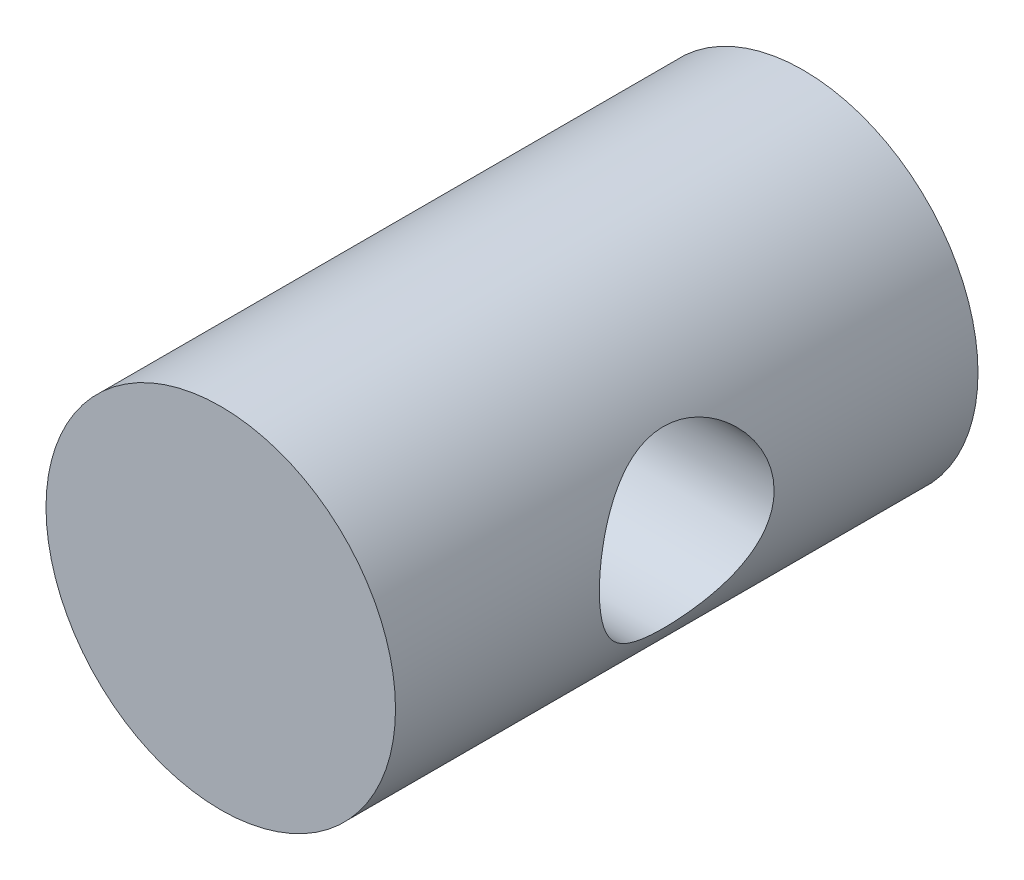
ISO-10303-21;
HEADER;
FILE_DESCRIPTION(('STEP AP214'),'2;1');
FILE_NAME('part.step','',(''),(''),'','','');
FILE_SCHEMA(('AUTOMOTIVE_DESIGN { 1 0 10303 214 1 1 1 1 }'));
ENDSEC;
DATA;
#1=APPLICATION_CONTEXT('core data for automotive mechanical design processes');
#2=APPLICATION_PROTOCOL_DEFINITION('international standard','automotive_design',2000,#1);
#3=PRODUCT_CONTEXT('',#1,'mechanical');
#4=PRODUCT('Part','Part','',(#3));
#5=PRODUCT_RELATED_PRODUCT_CATEGORY('part','',(#4));
#6=PRODUCT_DEFINITION_FORMATION('','',#4);
#7=PRODUCT_DEFINITION_CONTEXT('part definition',#1,'design');
#8=PRODUCT_DEFINITION('design','',#6,#7);
#9=PRODUCT_DEFINITION_SHAPE('','',#8);
#10=(LENGTH_UNIT() NAMED_UNIT(*) SI_UNIT(.MILLI.,.METRE.));
#11=(NAMED_UNIT(*) PLANE_ANGLE_UNIT() SI_UNIT($,.RADIAN.));
#12=(NAMED_UNIT(*) SI_UNIT($,.STERADIAN.) SOLID_ANGLE_UNIT());
#13=UNCERTAINTY_MEASURE_WITH_UNIT(LENGTH_MEASURE(1.E-05),#10,'distance_accuracy_value','');
#14=(GEOMETRIC_REPRESENTATION_CONTEXT(3) GLOBAL_UNCERTAINTY_ASSIGNED_CONTEXT((#13)) GLOBAL_UNIT_ASSIGNED_CONTEXT((#10,
#11,#12)) REPRESENTATION_CONTEXT('',''));
#15=CARTESIAN_POINT('',(0.,0.,0.));
#16=DIRECTION('',(0.,0.,1.));
#17=DIRECTION('',(1.,0.,0.));
#18=AXIS2_PLACEMENT_3D('',#15,#16,#17);
#19=CARTESIAN_POINT('',(0.,0.,10.));
#20=DIRECTION('',(0.,0.,-1.));
#21=DIRECTION('',(-1.,0.,0.));
#22=AXIS2_PLACEMENT_3D('',#19,#20,#21);
#23=CYLINDRICAL_SURFACE('',#22,3.);
#24=CARTESIAN_POINT('',(3.,0.,6.5));
#25=CARTESIAN_POINT('',(2.99999570107562,-0.0788579444268502,6.49999504652421));
#26=CARTESIAN_POINT('',(2.99685736529635,-0.157809899546344,6.49374489031842));
#27=CARTESIAN_POINT('',(2.98461234055736,-0.313380352903344,6.46902067948769));
#28=CARTESIAN_POINT('',(2.97549431743379,-0.389994130070444,6.45052341050328));
#29=CARTESIAN_POINT('',(2.95224419105063,-0.538400317320674,6.40220928707506));
#30=CARTESIAN_POINT('',(2.93813158766306,-0.61021020440872,6.37243642362805));
#31=CARTESIAN_POINT('',(2.90618664773642,-0.747708925209898,6.30264406795252));
#32=CARTESIAN_POINT('',(2.88835460450288,-0.813398240985089,6.2626253836267));
#33=CARTESIAN_POINT('',(2.84934387387093,-0.941261726642864,6.17072412577207));
#34=CARTESIAN_POINT('',(2.82802798691306,-1.00298281668316,6.11827028114054));
#35=CARTESIAN_POINT('',(2.78489955370115,-1.11716916730047,6.00421778112945));
#36=CARTESIAN_POINT('',(2.76308664313552,-1.16962737466015,5.94261222234134));
#37=CARTESIAN_POINT('',(2.71948426796021,-1.26787800067542,5.80627497571493));
#38=CARTESIAN_POINT('',(2.69782780455198,-1.31283800332746,5.73089585248113));
#39=CARTESIAN_POINT('',(2.65928968158481,-1.38925234033604,5.57244899602068));
#40=CARTESIAN_POINT('',(2.64240461410484,-1.4207163224495,5.48938680691588));
#41=CARTESIAN_POINT('',(2.61686800556713,-1.46719866328288,5.32300234186712));
#42=CARTESIAN_POINT('',(2.6077840737557,-1.48308878562066,5.23999332189891));
#43=CARTESIAN_POINT('',(2.59772834922792,-1.50064048996327,5.07203174333078));
#44=CARTESIAN_POINT('',(2.59674854014932,-1.50231613255961,4.98708118869327));
#45=CARTESIAN_POINT('',(2.60266395385873,-1.49203093075844,4.82857096352695));
#46=CARTESIAN_POINT('',(2.6086314549302,-1.48167683930523,4.75486395316543));
#47=CARTESIAN_POINT('',(2.62614343100775,-1.4504097735854,4.61041713594044));
#48=CARTESIAN_POINT('',(2.63768968247664,-1.42949343584648,4.53967828204203));
#49=CARTESIAN_POINT('',(2.66531214619112,-1.37731467057901,4.40115630115151));
#50=CARTESIAN_POINT('',(2.68148760995998,-1.34582260067399,4.33348040182132));
#51=CARTESIAN_POINT('',(2.71655106422106,-1.273562531502,4.20404856111499));
#52=CARTESIAN_POINT('',(2.73544027170286,-1.2327903657187,4.14229529659987));
#53=CARTESIAN_POINT('',(2.77669736854929,-1.13709908236918,4.01821812088516));
#54=CARTESIAN_POINT('',(2.79920265355119,-1.08104168755392,3.95681468963576));
#55=CARTESIAN_POINT('',(2.84321434950611,-0.95933336811206,3.84389687211365));
#56=CARTESIAN_POINT('',(2.86472027938201,-0.893677884861428,3.79238721194918));
#57=CARTESIAN_POINT('',(2.90552980924446,-0.750774758747773,3.69847150845541));
#58=CARTESIAN_POINT('',(2.92468476243011,-0.673130387399113,3.65659929133139));
#59=CARTESIAN_POINT('',(2.95736821681863,-0.510699323233195,3.58685445643549));
#60=CARTESIAN_POINT('',(2.9709011841533,-0.425918364397914,3.55897072247725));
#61=CARTESIAN_POINT('',(2.98986500612153,-0.259149737491053,3.52028689442499));
#62=CARTESIAN_POINT('',(2.99587407451965,-0.177512295822489,3.50826314637983));
#63=CARTESIAN_POINT('',(3.00109520188655,-0.0131693999240275,3.49780290329827));
#64=CARTESIAN_POINT('',(3.00031048081978,0.0695355298048631,3.4993599715408));
#65=CARTESIAN_POINT('',(2.99236788380152,0.22684945797898,3.51531003262812));
#66=CARTESIAN_POINT('',(2.98570868532252,0.301589112074895,3.52869879909499));
#67=CARTESIAN_POINT('',(2.9673325697226,0.447610338452912,3.56635710784268));
#68=CARTESIAN_POINT('',(2.95561509501618,0.518891528536631,3.59062784968024));
#69=CARTESIAN_POINT('',(2.92776377120382,0.658332912674359,3.64999769964955));
#70=CARTESIAN_POINT('',(2.91151322654446,0.726345595508705,3.68538657517443));
#71=CARTESIAN_POINT('',(2.87615961476126,0.855692042548907,3.76566130346985));
#72=CARTESIAN_POINT('',(2.85705533350407,0.917022944664887,3.81055120189309));
#73=CARTESIAN_POINT('',(2.81562332004297,1.03765153393382,3.91364063799607));
#74=CARTESIAN_POINT('',(2.79316327265249,1.09615811672854,3.97271430266772));
#75=CARTESIAN_POINT('',(2.7489358741323,1.20278448167828,4.09988772691659));
#76=CARTESIAN_POINT('',(2.72716901100071,1.25089707856781,4.16799367827188));
#77=CARTESIAN_POINT('',(2.68576788309734,1.33756187171853,4.31546548125946));
#78=CARTESIAN_POINT('',(2.66628794383591,1.37553824370037,4.39521689914172));
#79=CARTESIAN_POINT('',(2.63361108441202,1.43712423890206,4.56126510136245));
#80=CARTESIAN_POINT('',(2.62040607332625,1.46075237380052,4.64755328970034));
#81=CARTESIAN_POINT('',(2.60342251538703,1.49079253120031,4.81536533432706));
#82=CARTESIAN_POINT('',(2.59886075197597,1.49863949460818,4.89655138015286));
#83=CARTESIAN_POINT('',(2.59748031962405,1.5010337315643,5.05917060074679));
#84=CARTESIAN_POINT('',(2.60065829439585,1.49558676993486,5.14060365310679));
#85=CARTESIAN_POINT('',(2.61356793076615,1.47288918838996,5.29322525230016));
#86=CARTESIAN_POINT('',(2.62264641723988,1.45681247151455,5.36465070521711));
#87=CARTESIAN_POINT('',(2.64556524281479,1.41476303733662,5.50371217913655));
#88=CARTESIAN_POINT('',(2.65940711354503,1.38878713673988,5.57134697313805));
#89=CARTESIAN_POINT('',(2.69142795546804,1.32572361795085,5.70593727647981));
#90=CARTESIAN_POINT('',(2.70983583593881,1.28800670672355,5.77254185274354));
#91=CARTESIAN_POINT('',(2.74852997452291,1.20322645745609,5.89891180427189));
#92=CARTESIAN_POINT('',(2.76881720693416,1.15615825686234,5.95867359578167));
#93=CARTESIAN_POINT('',(2.81193484737138,1.04730498999206,6.07721297353201));
#94=CARTESIAN_POINT('',(2.83477474959942,0.984426634495892,6.13498865352544));
#95=CARTESIAN_POINT('',(2.87816628389896,0.849232209349796,6.2393944751529));
#96=CARTESIAN_POINT('',(2.89871667939293,0.776911084957796,6.28601860920486));
#97=CARTESIAN_POINT('',(2.93547014349806,0.623897395174419,6.3668545440681));
#98=CARTESIAN_POINT('',(2.95164144740899,0.543149255665096,6.4009762538547));
#99=CARTESIAN_POINT('',(2.9775201194848,0.37611315170713,6.45471225163611));
#100=CARTESIAN_POINT('',(2.98724585044602,0.28984169938365,6.47436777020857));
#101=CARTESIAN_POINT('',(2.99543192870217,0.168902919736342,6.49084611662861));
#102=CARTESIAN_POINT('',(2.99714048010376,0.135242819162347,6.49427396129951));
#103=CARTESIAN_POINT('',(2.99942545465223,0.0677275977076368,6.49885199827113));
#104=CARTESIAN_POINT('',(3.00000184655071,0.0338724714699424,6.50000212770531));
#105=CARTESIAN_POINT('',(3.,0.,6.5));
#106=B_SPLINE_CURVE_WITH_KNOTS('',3,(#24,#25,#26,#27,#28,#29,#30,#31,#32,#33,#34,#35,#36,#37,
#38,#39,#40,#41,#42,#43,#44,#45,#46,#47,#48,#49,#50,#51,#52,#53,#54,#55,#56,#57,#58,#59,#60,#61,
#62,#63,#64,#65,#66,#67,#68,#69,#70,#71,#72,#73,#74,#75,#76,#77,#78,#79,#80,#81,#82,#83,#84,#85,
#86,#87,#88,#89,#90,#91,#92,#93,#94,#95,#96,#97,#98,#99,#100,#101,#102,#103,#104,#105),
.UNSPECIFIED.,.T.,.F.,(4,2,2,2,2,2,2,2,2,2,2,2,2,2,2,2,2,2,2,2,2,2,2,2,2,2,2,2,2,2,2,2,2,2,2,2,
2,2,2,2,4),(0.,0.236436386130439,0.473322224563796,0.709293233238448,0.945245640872351,
1.19547263807713,1.44588935648105,1.71572589646129,1.98536921847421,2.23887018210344,
2.49212035993531,2.71508568613981,2.93812205888518,3.16635360252731,3.39468781890333,
3.65197412000818,3.90938301898029,4.17874533321661,4.44789325368419,4.69474935707018,
4.94148846767214,5.16910359759183,5.39674382446397,5.63089284041848,5.86514176122509,
6.12239415966628,6.37982382923148,6.64972023242589,6.91926767918176,7.1629396125457,
7.40650589797017,7.62686895373284,7.84730293182527,8.08254685170431,8.31791341715446,
8.58187864135757,8.84598575071869,9.1119602049529,9.37717362931724,9.47872920200875,
9.58028757766599),.UNSPECIFIED.);
#107=CARTESIAN_POINT('',(3.,0.,6.5));
#108=VERTEX_POINT('',#107);
#109=EDGE_CURVE('E46',#108,#108,#106,.T.);
#110=ORIENTED_EDGE('',*,*,#109,.F.);
#111=EDGE_LOOP('',(#110));
#112=FACE_BOUND('',#111,.T.);
#113=CARTESIAN_POINT('',(0.,0.,10.));
#114=DIRECTION('',(0.,0.,1.));
#115=DIRECTION('',(1.,0.,0.));
#116=AXIS2_PLACEMENT_3D('',#113,#114,#115);
#117=CIRCLE('',#116,3.);
#118=CARTESIAN_POINT('',(3.,0.,10.));
#119=VERTEX_POINT('',#118);
#120=EDGE_CURVE('E10',#119,#119,#117,.T.);
#121=ORIENTED_EDGE('',*,*,#120,.F.);
#122=EDGE_LOOP('',(#121));
#123=FACE_BOUND('',#122,.T.);
#124=CARTESIAN_POINT('',(0.,0.,0.));
#125=DIRECTION('',(0.,0.,1.));
#126=DIRECTION('',(1.,0.,0.));
#127=AXIS2_PLACEMENT_3D('',#124,#125,#126);
#128=CIRCLE('',#127,3.);
#129=CARTESIAN_POINT('',(3.,0.,0.));
#130=VERTEX_POINT('',#129);
#131=EDGE_CURVE('E40',#130,#130,#128,.T.);
#132=ORIENTED_EDGE('',*,*,#131,.T.);
#133=EDGE_LOOP('',(#132));
#134=FACE_BOUND('',#133,.T.);
#135=CARTESIAN_POINT('',(-3.,0.,6.5));
#136=CARTESIAN_POINT('',(-2.99999570107562,0.0788579444268502,6.49999504652421));
#137=CARTESIAN_POINT('',(-2.99685736529635,0.157809899546344,6.49374489031842));
#138=CARTESIAN_POINT('',(-2.98461234055736,0.313380352903344,6.46902067948769));
#139=CARTESIAN_POINT('',(-2.97549431743379,0.389994130070444,6.45052341050328));
#140=CARTESIAN_POINT('',(-2.95224419105063,0.538400317320674,6.40220928707506));
#141=CARTESIAN_POINT('',(-2.93813158766306,0.61021020440872,6.37243642362805));
#142=CARTESIAN_POINT('',(-2.90618664773642,0.747708925209898,6.30264406795252));
#143=CARTESIAN_POINT('',(-2.88835460450288,0.813398240985089,6.2626253836267));
#144=CARTESIAN_POINT('',(-2.84934387387093,0.941261726642864,6.17072412577207));
#145=CARTESIAN_POINT('',(-2.82802798691306,1.00298281668316,6.11827028114054));
#146=CARTESIAN_POINT('',(-2.78489955370115,1.11716916730047,6.00421778112945));
#147=CARTESIAN_POINT('',(-2.76308664313552,1.16962737466015,5.94261222234134));
#148=CARTESIAN_POINT('',(-2.71948426796021,1.26787800067542,5.80627497571493));
#149=CARTESIAN_POINT('',(-2.69782780455198,1.31283800332746,5.73089585248113));
#150=CARTESIAN_POINT('',(-2.65928968158481,1.38925234033604,5.57244899602068));
#151=CARTESIAN_POINT('',(-2.64240461410484,1.4207163224495,5.48938680691588));
#152=CARTESIAN_POINT('',(-2.61686800556713,1.46719866328288,5.32300234186712));
#153=CARTESIAN_POINT('',(-2.6077840737557,1.48308878562066,5.23999332189891));
#154=CARTESIAN_POINT('',(-2.59772834922792,1.50064048996327,5.07203174333078));
#155=CARTESIAN_POINT('',(-2.59674854014932,1.50231613255961,4.98708118869327));
#156=CARTESIAN_POINT('',(-2.60266395385873,1.49203093075844,4.82857096352695));
#157=CARTESIAN_POINT('',(-2.6086314549302,1.48167683930523,4.75486395316543));
#158=CARTESIAN_POINT('',(-2.62614343100775,1.4504097735854,4.61041713594044));
#159=CARTESIAN_POINT('',(-2.63768968247664,1.42949343584648,4.53967828204203));
#160=CARTESIAN_POINT('',(-2.66531214619112,1.37731467057901,4.40115630115151));
#161=CARTESIAN_POINT('',(-2.68148760995998,1.34582260067399,4.33348040182132));
#162=CARTESIAN_POINT('',(-2.71655106422106,1.273562531502,4.20404856111499));
#163=CARTESIAN_POINT('',(-2.73544027170286,1.2327903657187,4.14229529659987));
#164=CARTESIAN_POINT('',(-2.77669736854929,1.13709908236918,4.01821812088516));
#165=CARTESIAN_POINT('',(-2.79920265355119,1.08104168755392,3.95681468963576));
#166=CARTESIAN_POINT('',(-2.84321434950611,0.95933336811206,3.84389687211365));
#167=CARTESIAN_POINT('',(-2.86472027938201,0.893677884861428,3.79238721194918));
#168=CARTESIAN_POINT('',(-2.90552980924446,0.750774758747773,3.69847150845541));
#169=CARTESIAN_POINT('',(-2.92468476243011,0.673130387399113,3.65659929133139));
#170=CARTESIAN_POINT('',(-2.95736821681863,0.510699323233195,3.58685445643549));
#171=CARTESIAN_POINT('',(-2.9709011841533,0.425918364397914,3.55897072247725));
#172=CARTESIAN_POINT('',(-2.98986500612153,0.259149737491053,3.52028689442499));
#173=CARTESIAN_POINT('',(-2.99587407451965,0.177512295822489,3.50826314637983));
#174=CARTESIAN_POINT('',(-3.00109520188655,0.0131693999240275,3.49780290329827));
#175=CARTESIAN_POINT('',(-3.00031048081978,-0.0695355298048631,3.4993599715408));
#176=CARTESIAN_POINT('',(-2.99236788380152,-0.22684945797898,3.51531003262812));
#177=CARTESIAN_POINT('',(-2.98570868532252,-0.301589112074895,3.52869879909499));
#178=CARTESIAN_POINT('',(-2.9673325697226,-0.447610338452912,3.56635710784268));
#179=CARTESIAN_POINT('',(-2.95561509501618,-0.518891528536631,3.59062784968024));
#180=CARTESIAN_POINT('',(-2.92776377120382,-0.658332912674359,3.64999769964955));
#181=CARTESIAN_POINT('',(-2.91151322654446,-0.726345595508705,3.68538657517443));
#182=CARTESIAN_POINT('',(-2.87615961476126,-0.855692042548907,3.76566130346985));
#183=CARTESIAN_POINT('',(-2.85705533350407,-0.917022944664887,3.81055120189309));
#184=CARTESIAN_POINT('',(-2.81562332004297,-1.03765153393382,3.91364063799607));
#185=CARTESIAN_POINT('',(-2.79316327265249,-1.09615811672854,3.97271430266772));
#186=CARTESIAN_POINT('',(-2.7489358741323,-1.20278448167828,4.09988772691659));
#187=CARTESIAN_POINT('',(-2.72716901100071,-1.25089707856781,4.16799367827188));
#188=CARTESIAN_POINT('',(-2.68576788309734,-1.33756187171853,4.31546548125946));
#189=CARTESIAN_POINT('',(-2.66628794383591,-1.37553824370037,4.39521689914172));
#190=CARTESIAN_POINT('',(-2.63361108441202,-1.43712423890206,4.56126510136245));
#191=CARTESIAN_POINT('',(-2.62040607332625,-1.46075237380052,4.64755328970034));
#192=CARTESIAN_POINT('',(-2.60342251538703,-1.49079253120031,4.81536533432706));
#193=CARTESIAN_POINT('',(-2.59886075197597,-1.49863949460818,4.89655138015286));
#194=CARTESIAN_POINT('',(-2.59748031962405,-1.5010337315643,5.05917060074679));
#195=CARTESIAN_POINT('',(-2.60065829439585,-1.49558676993486,5.14060365310679));
#196=CARTESIAN_POINT('',(-2.61356793076615,-1.47288918838996,5.29322525230016));
#197=CARTESIAN_POINT('',(-2.62264641723988,-1.45681247151455,5.36465070521711));
#198=CARTESIAN_POINT('',(-2.64556524281479,-1.41476303733662,5.50371217913655));
#199=CARTESIAN_POINT('',(-2.65940711354503,-1.38878713673988,5.57134697313805));
#200=CARTESIAN_POINT('',(-2.69142795546804,-1.32572361795085,5.70593727647981));
#201=CARTESIAN_POINT('',(-2.70983583593881,-1.28800670672355,5.77254185274354));
#202=CARTESIAN_POINT('',(-2.74852997452291,-1.20322645745609,5.89891180427189));
#203=CARTESIAN_POINT('',(-2.76881720693416,-1.15615825686234,5.95867359578167));
#204=CARTESIAN_POINT('',(-2.81193484737138,-1.04730498999206,6.07721297353201));
#205=CARTESIAN_POINT('',(-2.83477474959942,-0.984426634495892,6.13498865352544));
#206=CARTESIAN_POINT('',(-2.87816628389896,-0.849232209349796,6.2393944751529));
#207=CARTESIAN_POINT('',(-2.89871667939293,-0.776911084957796,6.28601860920486));
#208=CARTESIAN_POINT('',(-2.93547014349806,-0.623897395174419,6.3668545440681));
#209=CARTESIAN_POINT('',(-2.95164144740899,-0.543149255665096,6.4009762538547));
#210=CARTESIAN_POINT('',(-2.9775201194848,-0.37611315170713,6.45471225163611));
#211=CARTESIAN_POINT('',(-2.98724585044602,-0.28984169938365,6.47436777020857));
#212=CARTESIAN_POINT('',(-2.99543192870217,-0.168902919736342,6.49084611662861));
#213=CARTESIAN_POINT('',(-2.99714048010376,-0.135242819162347,6.49427396129951));
#214=CARTESIAN_POINT('',(-2.99942545465223,-0.0677275977076368,6.49885199827113));
#215=CARTESIAN_POINT('',(-3.00000184655071,-0.0338724714699424,6.50000212770531));
#216=CARTESIAN_POINT('',(-3.,0.,6.5));
#217=B_SPLINE_CURVE_WITH_KNOTS('',3,(#135,#136,#137,#138,#139,#140,#141,#142,#143,#144,#145,
#146,#147,#148,#149,#150,#151,#152,#153,#154,#155,#156,#157,#158,#159,#160,#161,#162,#163,#164,
#165,#166,#167,#168,#169,#170,#171,#172,#173,#174,#175,#176,#177,#178,#179,#180,#181,#182,#183,
#184,#185,#186,#187,#188,#189,#190,#191,#192,#193,#194,#195,#196,#197,#198,#199,#200,#201,#202,
#203,#204,#205,#206,#207,#208,#209,#210,#211,#212,#213,#214,#215,#216),.UNSPECIFIED.,.T.,.F.,(4,
2,2,2,2,2,2,2,2,2,2,2,2,2,2,2,2,2,2,2,2,2,2,2,2,2,2,2,2,2,2,2,2,2,2,2,2,2,2,2,4),(0.,
0.236436386130439,0.473322224563796,0.709293233238448,0.945245640872351,1.19547263807713,
1.44588935648105,1.71572589646129,1.98536921847421,2.23887018210344,2.49212035993531,
2.71508568613981,2.93812205888518,3.16635360252731,3.39468781890333,3.65197412000818,
3.90938301898029,4.17874533321661,4.44789325368419,4.69474935707018,4.94148846767214,
5.16910359759183,5.39674382446397,5.63089284041848,5.86514176122509,6.12239415966628,
6.37982382923148,6.64972023242589,6.91926767918176,7.1629396125457,7.40650589797017,
7.62686895373284,7.84730293182527,8.08254685170431,8.31791341715446,8.58187864135757,
8.84598575071869,9.1119602049529,9.37717362931724,9.47872920200875,9.58028757766599),.UNSPECIFIED.);
#218=CARTESIAN_POINT('',(-3.,0.,6.5));
#219=VERTEX_POINT('',#218);
#220=EDGE_CURVE('E33',#219,#219,#217,.T.);
#221=ORIENTED_EDGE('',*,*,#220,.F.);
#222=EDGE_LOOP('',(#221));
#223=FACE_BOUND('',#222,.T.);
#224=ADVANCED_FACE('F29',(#112,#123,#134,#223),#23,.T.);
#225=CARTESIAN_POINT('',(0.,0.,10.));
#226=DIRECTION('',(0.,0.,1.));
#227=DIRECTION('',(1.,0.,0.));
#228=AXIS2_PLACEMENT_3D('',#225,#226,#227);
#229=PLANE('',#228);
#230=ORIENTED_EDGE('',*,*,#120,.T.);
#231=EDGE_LOOP('',(#230));
#232=FACE_BOUND('',#231,.T.);
#233=ADVANCED_FACE('F56',(#232),#229,.T.);
#234=CARTESIAN_POINT('',(0.,0.,0.));
#235=DIRECTION('',(0.,0.,1.));
#236=DIRECTION('',(1.,0.,0.));
#237=AXIS2_PLACEMENT_3D('',#234,#235,#236);
#238=PLANE('',#237);
#239=ORIENTED_EDGE('',*,*,#131,.F.);
#240=EDGE_LOOP('',(#239));
#241=FACE_BOUND('',#240,.T.);
#242=ADVANCED_FACE('F54',(#241),#238,.F.);
#243=CARTESIAN_POINT('',(10.,0.,5.));
#244=DIRECTION('',(-1.,0.,0.));
#245=DIRECTION('',(0.,0.,1.));
#246=AXIS2_PLACEMENT_3D('',#243,#244,#245);
#247=CYLINDRICAL_SURFACE('',#246,1.5);
#248=ORIENTED_EDGE('',*,*,#109,.T.);
#249=EDGE_LOOP('',(#248));
#250=FACE_BOUND('',#249,.T.);
#251=ORIENTED_EDGE('',*,*,#220,.T.);
#252=EDGE_LOOP('',(#251));
#253=FACE_BOUND('',#252,.T.);
#254=ADVANCED_FACE('F50',(#250,#253),#247,.F.);
#255=CLOSED_SHELL('',(#224,#233,#242,#254));
#256=MANIFOLD_SOLID_BREP('B2',#255);
#257=ADVANCED_BREP_SHAPE_REPRESENTATION('',(#18,#256),#14);
#258=SHAPE_DEFINITION_REPRESENTATION(#9,#257);
ENDSEC;
END-ISO-10303-21;
